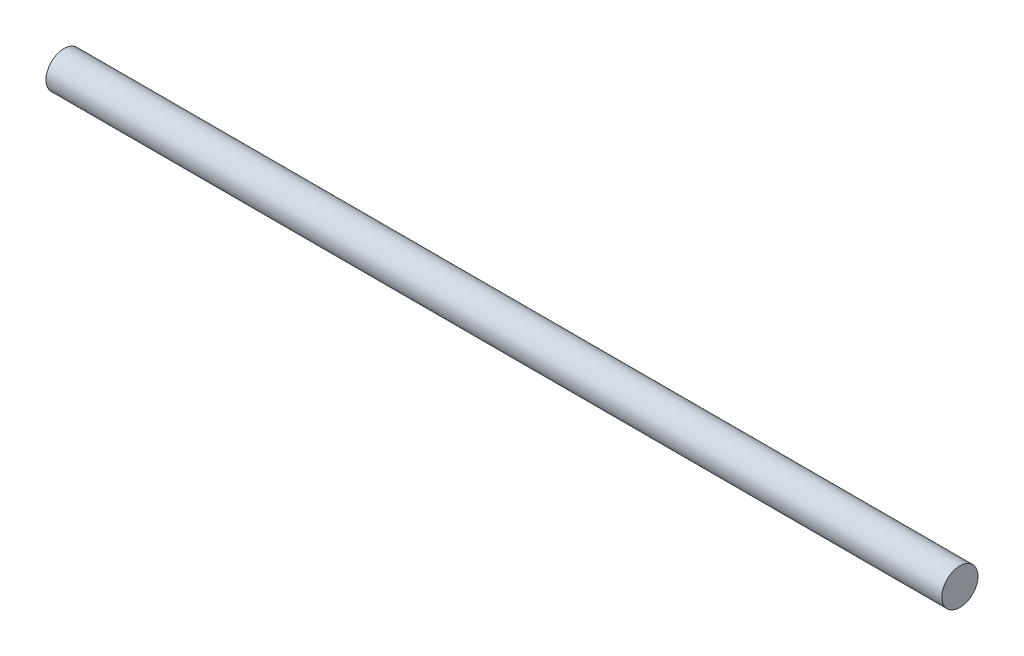
ISO-10303-21;
HEADER;
FILE_DESCRIPTION(('STEP AP214'),'2;1');
FILE_NAME('part.step','',(''),(''),'','','');
FILE_SCHEMA(('AUTOMOTIVE_DESIGN { 1 0 10303 214 1 1 1 1 }'));
ENDSEC;
DATA;
#1=APPLICATION_CONTEXT('core data for automotive mechanical design processes');
#2=APPLICATION_PROTOCOL_DEFINITION('international standard','automotive_design',2000,#1);
#3=PRODUCT_CONTEXT('',#1,'mechanical');
#4=PRODUCT('Part','Part','',(#3));
#5=PRODUCT_RELATED_PRODUCT_CATEGORY('part','',(#4));
#6=PRODUCT_DEFINITION_FORMATION('','',#4);
#7=PRODUCT_DEFINITION_CONTEXT('part definition',#1,'design');
#8=PRODUCT_DEFINITION('design','',#6,#7);
#9=PRODUCT_DEFINITION_SHAPE('','',#8);
#10=(LENGTH_UNIT() NAMED_UNIT(*) SI_UNIT(.MILLI.,.METRE.));
#11=(NAMED_UNIT(*) PLANE_ANGLE_UNIT() SI_UNIT($,.RADIAN.));
#12=(NAMED_UNIT(*) SI_UNIT($,.STERADIAN.) SOLID_ANGLE_UNIT());
#13=UNCERTAINTY_MEASURE_WITH_UNIT(LENGTH_MEASURE(1.E-05),#10,'distance_accuracy_value','');
#14=(GEOMETRIC_REPRESENTATION_CONTEXT(3) GLOBAL_UNCERTAINTY_ASSIGNED_CONTEXT((#13)) GLOBAL_UNIT_ASSIGNED_CONTEXT((#10,
#11,#12)) REPRESENTATION_CONTEXT('',''));
#15=CARTESIAN_POINT('',(0.,0.,0.));
#16=DIRECTION('',(0.,0.,1.));
#17=DIRECTION('',(1.,0.,0.));
#18=AXIS2_PLACEMENT_3D('',#15,#16,#17);
#19=CARTESIAN_POINT('',(65.,0.,0.));
#20=DIRECTION('',(-1.,0.,0.));
#21=DIRECTION('',(0.,0.,1.));
#22=AXIS2_PLACEMENT_3D('',#19,#20,#21);
#23=CYLINDRICAL_SURFACE('',#22,2.625);
#24=CARTESIAN_POINT('',(65.,0.,0.));
#25=DIRECTION('',(1.,0.,0.));
#26=DIRECTION('',(0.,0.,-1.));
#27=AXIS2_PLACEMENT_3D('',#24,#25,#26);
#28=CIRCLE('',#27,2.625);
#29=CARTESIAN_POINT('',(65.,0.,-2.625));
#30=VERTEX_POINT('',#29);
#31=EDGE_CURVE('E10',#30,#30,#28,.T.);
#32=ORIENTED_EDGE('',*,*,#31,.F.);
#33=EDGE_LOOP('',(#32));
#34=FACE_BOUND('',#33,.T.);
#35=CARTESIAN_POINT('',(-65.,0.,0.));
#36=DIRECTION('',(1.,0.,0.));
#37=DIRECTION('',(0.,0.,-1.));
#38=AXIS2_PLACEMENT_3D('',#35,#36,#37);
#39=CIRCLE('',#38,2.625);
#40=CARTESIAN_POINT('',(-65.,0.,-2.625));
#41=VERTEX_POINT('',#40);
#42=EDGE_CURVE('E40',#41,#41,#39,.T.);
#43=ORIENTED_EDGE('',*,*,#42,.T.);
#44=EDGE_LOOP('',(#43));
#45=FACE_BOUND('',#44,.T.);
#46=ADVANCED_FACE('F37',(#34,#45),#23,.T.);
#47=CARTESIAN_POINT('',(65.,0.,0.));
#48=DIRECTION('',(1.,0.,0.));
#49=DIRECTION('',(0.,0.,-1.));
#50=AXIS2_PLACEMENT_3D('',#47,#48,#49);
#51=PLANE('',#50);
#52=ORIENTED_EDGE('',*,*,#31,.T.);
#53=EDGE_LOOP('',(#52));
#54=FACE_BOUND('',#53,.T.);
#55=ADVANCED_FACE('F54',(#54),#51,.T.);
#56=CARTESIAN_POINT('',(-65.,0.,0.));
#57=DIRECTION('',(1.,0.,0.));
#58=DIRECTION('',(0.,0.,-1.));
#59=AXIS2_PLACEMENT_3D('',#56,#57,#58);
#60=PLANE('',#59);
#61=ORIENTED_EDGE('',*,*,#42,.F.);
#62=EDGE_LOOP('',(#61));
#63=FACE_BOUND('',#62,.T.);
#64=ADVANCED_FACE('F52',(#63),#60,.F.);
#65=CLOSED_SHELL('',(#46,#55,#64));
#66=MANIFOLD_SOLID_BREP('B2',#65);
#67=ADVANCED_BREP_SHAPE_REPRESENTATION('',(#18,#66),#14);
#68=SHAPE_DEFINITION_REPRESENTATION(#9,#67);
ENDSEC;
END-ISO-10303-21;
